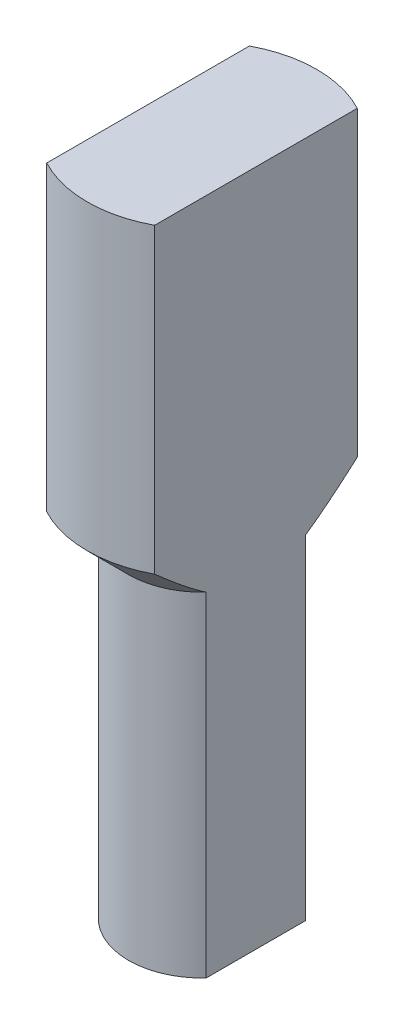
ISO-10303-21;
HEADER;
FILE_DESCRIPTION(('STEP AP214'),'2;1');
FILE_NAME('part.step','',(''),(''),'','','');
FILE_SCHEMA(('AUTOMOTIVE_DESIGN { 1 0 10303 214 1 1 1 1 }'));
ENDSEC;
DATA;
#1=APPLICATION_CONTEXT('core data for automotive mechanical design processes');
#2=APPLICATION_PROTOCOL_DEFINITION('international standard','automotive_design',2000,#1);
#3=PRODUCT_CONTEXT('',#1,'mechanical');
#4=PRODUCT('Part','Part','',(#3));
#5=PRODUCT_RELATED_PRODUCT_CATEGORY('part','',(#4));
#6=PRODUCT_DEFINITION_FORMATION('','',#4);
#7=PRODUCT_DEFINITION_CONTEXT('part definition',#1,'design');
#8=PRODUCT_DEFINITION('design','',#6,#7);
#9=PRODUCT_DEFINITION_SHAPE('','',#8);
#10=(LENGTH_UNIT() NAMED_UNIT(*) SI_UNIT(.MILLI.,.METRE.));
#11=(NAMED_UNIT(*) PLANE_ANGLE_UNIT() SI_UNIT($,.RADIAN.));
#12=(NAMED_UNIT(*) SI_UNIT($,.STERADIAN.) SOLID_ANGLE_UNIT());
#13=UNCERTAINTY_MEASURE_WITH_UNIT(LENGTH_MEASURE(1.E-05),#10,'distance_accuracy_value','');
#14=(GEOMETRIC_REPRESENTATION_CONTEXT(3) GLOBAL_UNCERTAINTY_ASSIGNED_CONTEXT((#13)) GLOBAL_UNIT_ASSIGNED_CONTEXT((#10,
#11,#12)) REPRESENTATION_CONTEXT('',''));
#15=CARTESIAN_POINT('',(0.,0.,0.));
#16=DIRECTION('',(0.,0.,1.));
#17=DIRECTION('',(1.,0.,0.));
#18=AXIS2_PLACEMENT_3D('',#15,#16,#17);
#19=CARTESIAN_POINT('',(0.,7.7,0.));
#20=DIRECTION('',(0.,-1.,0.));
#21=DIRECTION('',(0.,0.,-1.));
#22=AXIS2_PLACEMENT_3D('',#19,#20,#21);
#23=CYLINDRICAL_SURFACE('',#22,1.7);
#24=CARTESIAN_POINT('',(0.,0.,0.));
#25=DIRECTION('',(0.,1.,0.));
#26=DIRECTION('',(0.,0.,1.));
#27=AXIS2_PLACEMENT_3D('',#24,#25,#26);
#28=CIRCLE('',#27,1.7);
#29=CARTESIAN_POINT('',(1.25,0.,-1.15217186218029));
#30=VERTEX_POINT('',#29);
#31=CARTESIAN_POINT('',(-1.25,0.,-1.15217186218029));
#32=VERTEX_POINT('',#31);
#33=EDGE_CURVE('E140',#30,#32,#28,.T.);
#34=ORIENTED_EDGE('',*,*,#33,.T.);
#35=DIRECTION('',(0.,-1.,0.));
#36=VECTOR('',#35,1.);
#37=CARTESIAN_POINT('',(-1.25,7.7,-1.15217186218029));
#38=LINE('',#37,#36);
#39=CARTESIAN_POINT('',(-1.25,7.74077318064675,-1.15217186218029));
#40=VERTEX_POINT('',#39);
#41=EDGE_CURVE('E72',#40,#32,#38,.T.);
#42=ORIENTED_EDGE('',*,*,#41,.F.);
#43=CARTESIAN_POINT('',(0.,7.74077318064675,0.));
#44=DIRECTION('',(0.,1.,0.));
#45=DIRECTION('',(0.,0.,1.));
#46=AXIS2_PLACEMENT_3D('',#43,#44,#45);
#47=CIRCLE('',#46,1.7);
#48=CARTESIAN_POINT('',(1.25,7.74077318064675,-1.15217186218029));
#49=VERTEX_POINT('',#48);
#50=EDGE_CURVE('E53',#40,#49,#47,.F.);
#51=ORIENTED_EDGE('',*,*,#50,.T.);
#52=DIRECTION('',(0.,-1.,0.));
#53=VECTOR('',#52,1.);
#54=CARTESIAN_POINT('',(1.25,7.7,-1.15217186218029));
#55=LINE('',#54,#53);
#56=EDGE_CURVE('E60',#49,#30,#55,.T.);
#57=ORIENTED_EDGE('',*,*,#56,.T.);
#58=EDGE_LOOP('',(#34,#42,#51,#57));
#59=FACE_BOUND('',#58,.T.);
#60=ADVANCED_FACE('F41',(#59),#23,.T.);
#61=CARTESIAN_POINT('',(-1.25,7.7,1.15217186218029));
#62=DIRECTION('',(1.,0.,0.));
#63=DIRECTION('',(0.,0.,-1.));
#64=AXIS2_PLACEMENT_3D('',#61,#62,#63);
#65=PLANE('',#64);
#66=CARTESIAN_POINT('',(-1.25,8.70000000000002,-2.34712319164709));
#67=CARTESIAN_POINT('',(-1.25,8.65771953403666,-2.29921835823615));
#68=CARTESIAN_POINT('',(-1.25,8.61559744786191,-2.25117442120293));
#69=CARTESIAN_POINT('',(-1.25,8.53173569460289,-2.15475291733536));
#70=CARTESIAN_POINT('',(-1.25,8.48999603283272,-2.10637534588121));
#71=CARTESIAN_POINT('',(-1.25,8.36552617657615,-1.96074907784932));
#72=CARTESIAN_POINT('',(-1.25,8.28346823760264,-1.86292019705318));
#73=CARTESIAN_POINT('',(-1.25,8.16237446128978,-1.71449756745111));
#74=CARTESIAN_POINT('',(-1.25,8.12232956512841,-1.66472728031569));
#75=CARTESIAN_POINT('',(-1.25,8.04309085742798,-1.56451835124509));
#76=CARTESIAN_POINT('',(-1.25,8.00389698336175,-1.51407975885378));
#77=CARTESIAN_POINT('',(-1.25,7.92653935131077,-1.41234366272262));
#78=CARTESIAN_POINT('',(-1.25,7.88837653558048,-1.36104543841813));
#79=CARTESIAN_POINT('',(-1.25,7.81344343422414,-1.25742376985534));
#80=CARTESIAN_POINT('',(-1.25,7.77667351085826,-1.20510006418869));
#81=CARTESIAN_POINT('',(-1.25,7.74077318064675,-1.15217186218029));
#82=B_SPLINE_CURVE_WITH_KNOTS('',3,(#66,#67,#68,#69,#70,#71,#72,#73,#74,#75,#76,#77,#78,#79,#80,
#81),.UNSPECIFIED.,.F.,.F.,(4,2,2,2,2,2,2,4),(0.,0.191681854093422,0.383366367736136,
0.766387968067563,0.958021430284511,1.14964076463686,1.341429665386,1.5332681083946),.UNSPECIFIED.);
#83=CARTESIAN_POINT('',(-1.25,8.70000000000002,-2.34712319164709));
#84=VERTEX_POINT('',#83);
#85=EDGE_CURVE('E180',#84,#40,#82,.T.);
#86=ORIENTED_EDGE('',*,*,#85,.T.);
#87=ORIENTED_EDGE('',*,*,#41,.T.);
#88=DIRECTION('',(0.,0.,1.));
#89=VECTOR('',#88,1.);
#90=CARTESIAN_POINT('',(-1.25,0.,1.15217186218029));
#91=LINE('',#90,#89);
#92=CARTESIAN_POINT('',(-1.25,0.,1.15217186218029));
#93=VERTEX_POINT('',#92);
#94=EDGE_CURVE('E144',#32,#93,#91,.T.);
#95=ORIENTED_EDGE('',*,*,#94,.T.);
#96=DIRECTION('',(0.,-1.,0.));
#97=VECTOR('',#96,1.);
#98=CARTESIAN_POINT('',(-1.25,7.7,1.15217186218029));
#99=LINE('',#98,#97);
#100=CARTESIAN_POINT('',(-1.25,7.74077318064675,1.15217186218029));
#101=VERTEX_POINT('',#100);
#102=EDGE_CURVE('E81',#101,#93,#99,.T.);
#103=ORIENTED_EDGE('',*,*,#102,.F.);
#104=CARTESIAN_POINT('',(-1.25,7.74077318064675,1.15217186218029));
#105=CARTESIAN_POINT('',(-1.25,7.77667351085826,1.20510006418869));
#106=CARTESIAN_POINT('',(-1.25,7.81344343422414,1.25742376985534));
#107=CARTESIAN_POINT('',(-1.25,7.88837653558048,1.36104543841813));
#108=CARTESIAN_POINT('',(-1.25,7.92653935131077,1.41234366272262));
#109=CARTESIAN_POINT('',(-1.25,8.00389698336175,1.51407975885378));
#110=CARTESIAN_POINT('',(-1.25,8.04309085742798,1.56451835124509));
#111=CARTESIAN_POINT('',(-1.25,8.12232956512841,1.66472728031569));
#112=CARTESIAN_POINT('',(-1.25,8.16237446128978,1.71449756745111));
#113=CARTESIAN_POINT('',(-1.25,8.28346823760264,1.86292019705318));
#114=CARTESIAN_POINT('',(-1.25,8.36552617657615,1.96074907784932));
#115=CARTESIAN_POINT('',(-1.25,8.48999603283272,2.10637534588121));
#116=CARTESIAN_POINT('',(-1.25,8.53173569460289,2.15475291733536));
#117=CARTESIAN_POINT('',(-1.25,8.61559744786191,2.25117442120293));
#118=CARTESIAN_POINT('',(-1.25,8.65771953403666,2.29921835823615));
#119=CARTESIAN_POINT('',(-1.25,8.70000000000002,2.34712319164709));
#120=B_SPLINE_CURVE_WITH_KNOTS('',3,(#104,#105,#106,#107,#108,#109,#110,#111,#112,#113,#114,
#115,#116,#117,#118,#119),.UNSPECIFIED.,.F.,.F.,(4,2,2,2,2,2,2,4),(0.,0.191838443008598,
0.383627343757737,0.575246678110089,0.766880140327036,1.14990174065846,1.34158625430118,
1.5332681083946),.UNSPECIFIED.);
#121=CARTESIAN_POINT('',(-1.25,8.70000000000002,2.34712319164709));
#122=VERTEX_POINT('',#121);
#123=EDGE_CURVE('E172',#101,#122,#120,.T.);
#124=ORIENTED_EDGE('',*,*,#123,.T.);
#125=DIRECTION('',(0.,-1.,0.));
#126=VECTOR('',#125,1.);
#127=CARTESIAN_POINT('',(-1.25,15.7,2.34712319164709));
#128=LINE('',#127,#126);
#129=CARTESIAN_POINT('',(-1.25,15.7,2.34712319164709));
#130=VERTEX_POINT('',#129);
#131=EDGE_CURVE('E314',#130,#122,#128,.T.);
#132=ORIENTED_EDGE('',*,*,#131,.F.);
#133=DIRECTION('',(0.,0.,1.));
#134=VECTOR('',#133,1.);
#135=CARTESIAN_POINT('',(-1.25,15.7,2.34712319164709));
#136=LINE('',#135,#134);
#137=CARTESIAN_POINT('',(-1.25,15.7,-2.34712319164709));
#138=VERTEX_POINT('',#137);
#139=EDGE_CURVE('E129',#138,#130,#136,.T.);
#140=ORIENTED_EDGE('',*,*,#139,.F.);
#141=DIRECTION('',(0.,-1.,0.));
#142=VECTOR('',#141,1.);
#143=CARTESIAN_POINT('',(-1.25,15.7,-2.34712319164709));
#144=LINE('',#143,#142);
#145=EDGE_CURVE('E146',#138,#84,#144,.T.);
#146=ORIENTED_EDGE('',*,*,#145,.T.);
#147=EDGE_LOOP('',(#86,#87,#95,#103,#124,#132,#140,#146));
#148=FACE_BOUND('',#147,.T.);
#149=ADVANCED_FACE('F186',(#148),#65,.F.);
#150=CARTESIAN_POINT('',(0.,7.7,0.));
#151=DIRECTION('',(0.,-1.,0.));
#152=DIRECTION('',(0.,0.,-1.));
#153=AXIS2_PLACEMENT_3D('',#150,#151,#152);
#154=CYLINDRICAL_SURFACE('',#153,1.7);
#155=CARTESIAN_POINT('',(0.,0.,0.));
#156=DIRECTION('',(0.,1.,0.));
#157=DIRECTION('',(0.,0.,1.));
#158=AXIS2_PLACEMENT_3D('',#155,#156,#157);
#159=CIRCLE('',#158,1.7);
#160=CARTESIAN_POINT('',(1.25,0.,1.15217186218029));
#161=VERTEX_POINT('',#160);
#162=EDGE_CURVE('E152',#93,#161,#159,.T.);
#163=ORIENTED_EDGE('',*,*,#162,.T.);
#164=DIRECTION('',(0.,-1.,0.));
#165=VECTOR('',#164,1.);
#166=CARTESIAN_POINT('',(1.25,7.7,1.15217186218029));
#167=LINE('',#166,#165);
#168=CARTESIAN_POINT('',(1.25,7.74077318064675,1.15217186218029));
#169=VERTEX_POINT('',#168);
#170=EDGE_CURVE('E160',#169,#161,#167,.T.);
#171=ORIENTED_EDGE('',*,*,#170,.F.);
#172=CARTESIAN_POINT('',(0.,7.74077318064675,0.));
#173=DIRECTION('',(0.,1.,0.));
#174=DIRECTION('',(0.,0.,1.));
#175=AXIS2_PLACEMENT_3D('',#172,#173,#174);
#176=CIRCLE('',#175,1.7);
#177=EDGE_CURVE('E11',#169,#101,#176,.F.);
#178=ORIENTED_EDGE('',*,*,#177,.T.);
#179=ORIENTED_EDGE('',*,*,#102,.T.);
#180=EDGE_LOOP('',(#163,#171,#178,#179));
#181=FACE_BOUND('',#180,.T.);
#182=ADVANCED_FACE('F191',(#181),#154,.T.);
#183=CARTESIAN_POINT('',(1.25,7.7,1.15217186218029));
#184=DIRECTION('',(-1.,0.,0.));
#185=DIRECTION('',(0.,0.,1.));
#186=AXIS2_PLACEMENT_3D('',#183,#184,#185);
#187=PLANE('',#186);
#188=ORIENTED_EDGE('',*,*,#56,.F.);
#189=CARTESIAN_POINT('',(1.25,7.74077318064675,-1.15217186218029));
#190=CARTESIAN_POINT('',(1.25,7.77667351085826,-1.20510006418869));
#191=CARTESIAN_POINT('',(1.25,7.81344343422414,-1.25742376985534));
#192=CARTESIAN_POINT('',(1.25,7.88837653558048,-1.36104543841813));
#193=CARTESIAN_POINT('',(1.25,7.92653935131077,-1.41234366272262));
#194=CARTESIAN_POINT('',(1.25,8.00389698336175,-1.51407975885378));
#195=CARTESIAN_POINT('',(1.25,8.04309085742798,-1.56451835124509));
#196=CARTESIAN_POINT('',(1.25,8.12232956512841,-1.66472728031569));
#197=CARTESIAN_POINT('',(1.25,8.16237446128978,-1.71449756745111));
#198=CARTESIAN_POINT('',(1.25,8.28346823760264,-1.86292019705318));
#199=CARTESIAN_POINT('',(1.25,8.36552617657615,-1.96074907784932));
#200=CARTESIAN_POINT('',(1.25,8.48999603283272,-2.10637534588121));
#201=CARTESIAN_POINT('',(1.25,8.53173569460289,-2.15475291733536));
#202=CARTESIAN_POINT('',(1.25,8.61559744786191,-2.25117442120293));
#203=CARTESIAN_POINT('',(1.25,8.65771953403666,-2.29921835823615));
#204=CARTESIAN_POINT('',(1.25,8.70000000000002,-2.34712319164709));
#205=B_SPLINE_CURVE_WITH_KNOTS('',3,(#189,#190,#191,#192,#193,#194,#195,#196,#197,#198,#199,
#200,#201,#202,#203,#204),.UNSPECIFIED.,.F.,.F.,(4,2,2,2,2,2,2,4),(0.,0.191838443008598,
0.383627343757737,0.575246678110089,0.766880140327036,1.14990174065846,1.34158625430118,
1.5332681083946),.UNSPECIFIED.);
#206=CARTESIAN_POINT('',(1.25,8.70000000000002,-2.34712319164709));
#207=VERTEX_POINT('',#206);
#208=EDGE_CURVE('E204',#49,#207,#205,.T.);
#209=ORIENTED_EDGE('',*,*,#208,.T.);
#210=DIRECTION('',(0.,-1.,0.));
#211=VECTOR('',#210,1.);
#212=CARTESIAN_POINT('',(1.25,15.7,-2.34712319164709));
#213=LINE('',#212,#211);
#214=CARTESIAN_POINT('',(1.25,15.7,-2.34712319164709));
#215=VERTEX_POINT('',#214);
#216=EDGE_CURVE('E119',#215,#207,#213,.T.);
#217=ORIENTED_EDGE('',*,*,#216,.F.);
#218=DIRECTION('',(0.,0.,-1.));
#219=VECTOR('',#218,1.);
#220=CARTESIAN_POINT('',(1.25,15.7,2.34712319164709));
#221=LINE('',#220,#219);
#222=CARTESIAN_POINT('',(1.25,15.7,2.34712319164709));
#223=VERTEX_POINT('',#222);
#224=EDGE_CURVE('E112',#223,#215,#221,.T.);
#225=ORIENTED_EDGE('',*,*,#224,.F.);
#226=DIRECTION('',(0.,-1.,0.));
#227=VECTOR('',#226,1.);
#228=CARTESIAN_POINT('',(1.25,15.7,2.34712319164709));
#229=LINE('',#228,#227);
#230=CARTESIAN_POINT('',(1.25,8.70000000000002,2.34712319164709));
#231=VERTEX_POINT('',#230);
#232=EDGE_CURVE('E117',#223,#231,#229,.T.);
#233=ORIENTED_EDGE('',*,*,#232,.T.);
#234=CARTESIAN_POINT('',(1.25,8.70000000000002,2.34712319164709));
#235=CARTESIAN_POINT('',(1.25,8.65771953403666,2.29921835823615));
#236=CARTESIAN_POINT('',(1.25,8.61559744786191,2.25117442120293));
#237=CARTESIAN_POINT('',(1.25,8.53173569460289,2.15475291733536));
#238=CARTESIAN_POINT('',(1.25,8.48999603283272,2.10637534588121));
#239=CARTESIAN_POINT('',(1.25,8.36552617657615,1.96074907784932));
#240=CARTESIAN_POINT('',(1.25,8.28346823760264,1.86292019705318));
#241=CARTESIAN_POINT('',(1.25,8.16237446128978,1.71449756745111));
#242=CARTESIAN_POINT('',(1.25,8.12232956512841,1.66472728031569));
#243=CARTESIAN_POINT('',(1.25,8.04309085742798,1.56451835124509));
#244=CARTESIAN_POINT('',(1.25,8.00389698336175,1.51407975885378));
#245=CARTESIAN_POINT('',(1.25,7.92653935131077,1.41234366272262));
#246=CARTESIAN_POINT('',(1.25,7.88837653558048,1.36104543841813));
#247=CARTESIAN_POINT('',(1.25,7.81344343422414,1.25742376985534));
#248=CARTESIAN_POINT('',(1.25,7.77667351085826,1.20510006418869));
#249=CARTESIAN_POINT('',(1.25,7.74077318064675,1.15217186218029));
#250=B_SPLINE_CURVE_WITH_KNOTS('',3,(#234,#235,#236,#237,#238,#239,#240,#241,#242,#243,#244,
#245,#246,#247,#248,#249),.UNSPECIFIED.,.F.,.F.,(4,2,2,2,2,2,2,4),(0.,0.191681854093422,
0.383366367736136,0.766387968067564,0.958021430284511,1.14964076463686,1.341429665386,
1.5332681083946),.UNSPECIFIED.);
#251=EDGE_CURVE('E211',#231,#169,#250,.T.);
#252=ORIENTED_EDGE('',*,*,#251,.T.);
#253=ORIENTED_EDGE('',*,*,#170,.T.);
#254=DIRECTION('',(0.,0.,-1.));
#255=VECTOR('',#254,1.);
#256=CARTESIAN_POINT('',(1.25,0.,1.15217186218029));
#257=LINE('',#256,#255);
#258=EDGE_CURVE('E155',#161,#30,#257,.T.);
#259=ORIENTED_EDGE('',*,*,#258,.T.);
#260=EDGE_LOOP('',(#188,#209,#217,#225,#233,#252,#253,#259));
#261=FACE_BOUND('',#260,.T.);
#262=ADVANCED_FACE('F114',(#261),#187,.F.);
#263=CARTESIAN_POINT('',(0.,0.,0.));
#264=DIRECTION('',(0.,1.,0.));
#265=DIRECTION('',(0.,0.,1.));
#266=AXIS2_PLACEMENT_3D('',#263,#264,#265);
#267=PLANE('',#266);
#268=ORIENTED_EDGE('',*,*,#33,.F.);
#269=ORIENTED_EDGE('',*,*,#258,.F.);
#270=ORIENTED_EDGE('',*,*,#162,.F.);
#271=ORIENTED_EDGE('',*,*,#94,.F.);
#272=EDGE_LOOP('',(#268,#269,#270,#271));
#273=FACE_BOUND('',#272,.T.);
#274=ADVANCED_FACE('F219',(#273),#267,.F.);
#275=CARTESIAN_POINT('',(0.,15.7,0.));
#276=DIRECTION('',(0.,-1.,0.));
#277=DIRECTION('',(0.,0.,-1.));
#278=AXIS2_PLACEMENT_3D('',#275,#276,#277);
#279=CYLINDRICAL_SURFACE('',#278,2.65922681935325);
#280=ORIENTED_EDGE('',*,*,#131,.T.);
#281=CARTESIAN_POINT('',(0.,8.70000000000002,0.));
#282=DIRECTION('',(0.,1.,0.));
#283=DIRECTION('',(0.,0.,1.));
#284=AXIS2_PLACEMENT_3D('',#281,#282,#283);
#285=CIRCLE('',#284,2.65922681935325);
#286=EDGE_CURVE('E138',#122,#231,#285,.T.);
#287=ORIENTED_EDGE('',*,*,#286,.T.);
#288=ORIENTED_EDGE('',*,*,#232,.F.);
#289=CARTESIAN_POINT('',(0.,15.7,0.));
#290=DIRECTION('',(0.,1.,0.));
#291=DIRECTION('',(0.,0.,1.));
#292=AXIS2_PLACEMENT_3D('',#289,#290,#291);
#293=CIRCLE('',#292,2.65922681935325);
#294=EDGE_CURVE('E124',#130,#223,#293,.T.);
#295=ORIENTED_EDGE('',*,*,#294,.F.);
#296=EDGE_LOOP('',(#280,#287,#288,#295));
#297=FACE_BOUND('',#296,.T.);
#298=ADVANCED_FACE('F136',(#297),#279,.T.);
#299=CARTESIAN_POINT('',(0.,15.7,0.));
#300=DIRECTION('',(0.,-1.,0.));
#301=DIRECTION('',(0.,0.,-1.));
#302=AXIS2_PLACEMENT_3D('',#299,#300,#301);
#303=CYLINDRICAL_SURFACE('',#302,2.65922681935325);
#304=ORIENTED_EDGE('',*,*,#216,.T.);
#305=CARTESIAN_POINT('',(0.,8.70000000000002,0.));
#306=DIRECTION('',(0.,1.,0.));
#307=DIRECTION('',(0.,0.,1.));
#308=AXIS2_PLACEMENT_3D('',#305,#306,#307);
#309=CIRCLE('',#308,2.65922681935325);
#310=EDGE_CURVE('E168',#207,#84,#309,.T.);
#311=ORIENTED_EDGE('',*,*,#310,.T.);
#312=ORIENTED_EDGE('',*,*,#145,.F.);
#313=CARTESIAN_POINT('',(0.,15.7,0.));
#314=DIRECTION('',(0.,1.,0.));
#315=DIRECTION('',(0.,0.,1.));
#316=AXIS2_PLACEMENT_3D('',#313,#314,#315);
#317=CIRCLE('',#316,2.65922681935325);
#318=EDGE_CURVE('E123',#215,#138,#317,.T.);
#319=ORIENTED_EDGE('',*,*,#318,.F.);
#320=EDGE_LOOP('',(#304,#311,#312,#319));
#321=FACE_BOUND('',#320,.T.);
#322=ADVANCED_FACE('F226',(#321),#303,.T.);
#323=CARTESIAN_POINT('',(0.,15.7,0.));
#324=DIRECTION('',(0.,1.,0.));
#325=DIRECTION('',(0.,0.,1.));
#326=AXIS2_PLACEMENT_3D('',#323,#324,#325);
#327=PLANE('',#326);
#328=ORIENTED_EDGE('',*,*,#294,.T.);
#329=ORIENTED_EDGE('',*,*,#224,.T.);
#330=ORIENTED_EDGE('',*,*,#318,.T.);
#331=ORIENTED_EDGE('',*,*,#139,.T.);
#332=EDGE_LOOP('',(#328,#329,#330,#331));
#333=FACE_BOUND('',#332,.T.);
#334=ADVANCED_FACE('F127',(#333),#327,.T.);
#335=CARTESIAN_POINT('',(0.,8.70000000000002,0.));
#336=DIRECTION('',(0.,1.,0.));
#337=DIRECTION('',(0.,0.,1.));
#338=AXIS2_PLACEMENT_3D('',#335,#336,#337);
#339=CONICAL_SURFACE('',#338,2.65922681935325,0.785398163397443);
#340=ORIENTED_EDGE('',*,*,#208,.F.);
#341=ORIENTED_EDGE('',*,*,#50,.F.);
#342=ORIENTED_EDGE('',*,*,#85,.F.);
#343=ORIENTED_EDGE('',*,*,#310,.F.);
#344=EDGE_LOOP('',(#340,#341,#342,#343));
#345=FACE_BOUND('',#344,.T.);
#346=ADVANCED_FACE('F196',(#345),#339,.T.);
#347=CARTESIAN_POINT('',(0.,8.70000000000002,0.));
#348=DIRECTION('',(0.,1.,0.));
#349=DIRECTION('',(0.,0.,1.));
#350=AXIS2_PLACEMENT_3D('',#347,#348,#349);
#351=CONICAL_SURFACE('',#350,2.65922681935325,0.785398163397443);
#352=ORIENTED_EDGE('',*,*,#123,.F.);
#353=ORIENTED_EDGE('',*,*,#177,.F.);
#354=ORIENTED_EDGE('',*,*,#251,.F.);
#355=ORIENTED_EDGE('',*,*,#286,.F.);
#356=EDGE_LOOP('',(#352,#353,#354,#355));
#357=FACE_BOUND('',#356,.T.);
#358=ADVANCED_FACE('F44',(#357),#351,.T.);
#359=CLOSED_SHELL('',(#60,#149,#182,#262,#274,#298,#322,#334,#346,#358));
#360=MANIFOLD_SOLID_BREP('B2',#359);
#361=ADVANCED_BREP_SHAPE_REPRESENTATION('',(#18,#360),#14);
#362=SHAPE_DEFINITION_REPRESENTATION(#9,#361);
ENDSEC;
END-ISO-10303-21;
